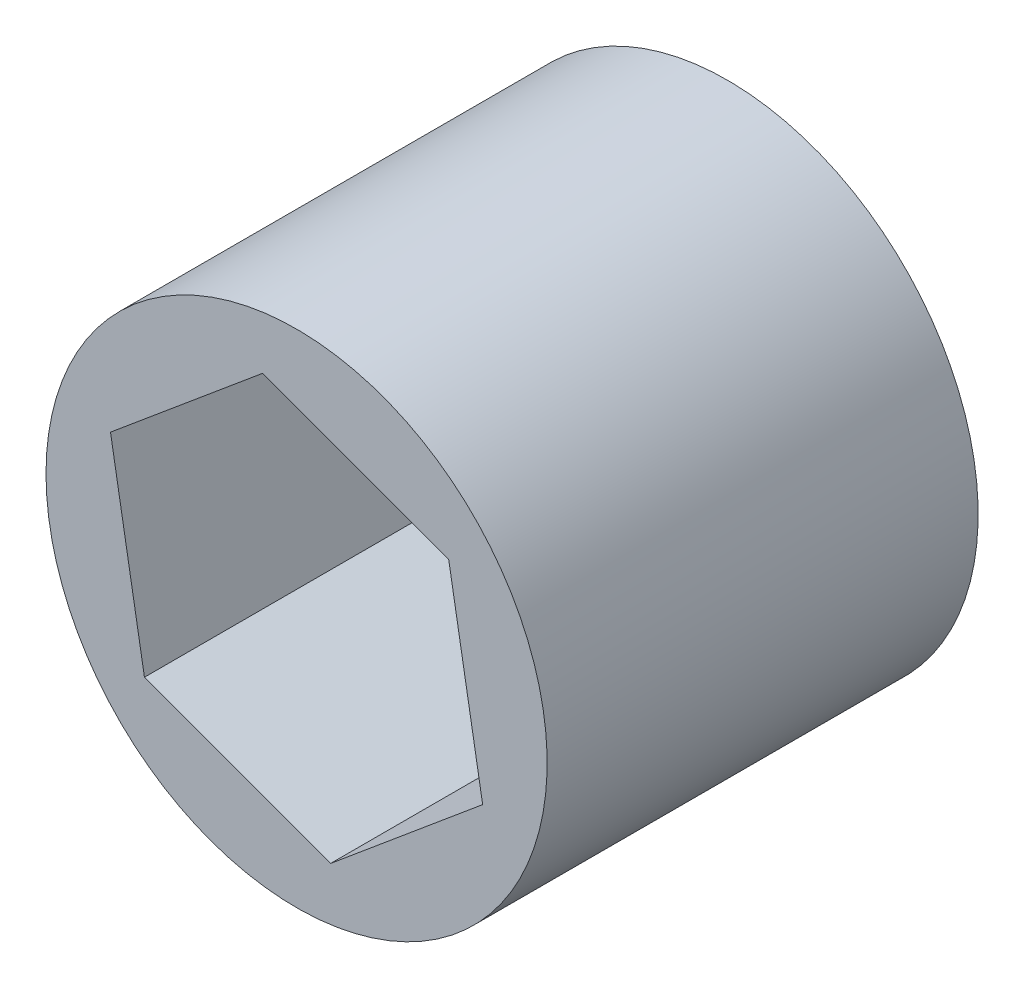
ISO-10303-21;
HEADER;
FILE_DESCRIPTION(('STEP AP214'),'2;1');
FILE_NAME('part.step','',(''),(''),'','','');
FILE_SCHEMA(('AUTOMOTIVE_DESIGN { 1 0 10303 214 1 1 1 1 }'));
ENDSEC;
DATA;
#1=APPLICATION_CONTEXT('core data for automotive mechanical design processes');
#2=APPLICATION_PROTOCOL_DEFINITION('international standard','automotive_design',2000,#1);
#3=PRODUCT_CONTEXT('',#1,'mechanical');
#4=PRODUCT('Part','Part','',(#3));
#5=PRODUCT_RELATED_PRODUCT_CATEGORY('part','',(#4));
#6=PRODUCT_DEFINITION_FORMATION('','',#4);
#7=PRODUCT_DEFINITION_CONTEXT('part definition',#1,'design');
#8=PRODUCT_DEFINITION('design','',#6,#7);
#9=PRODUCT_DEFINITION_SHAPE('','',#8);
#10=(LENGTH_UNIT() NAMED_UNIT(*) SI_UNIT(.MILLI.,.METRE.));
#11=(NAMED_UNIT(*) PLANE_ANGLE_UNIT() SI_UNIT($,.RADIAN.));
#12=(NAMED_UNIT(*) SI_UNIT($,.STERADIAN.) SOLID_ANGLE_UNIT());
#13=UNCERTAINTY_MEASURE_WITH_UNIT(LENGTH_MEASURE(1.E-05),#10,'distance_accuracy_value','');
#14=(GEOMETRIC_REPRESENTATION_CONTEXT(3) GLOBAL_UNCERTAINTY_ASSIGNED_CONTEXT((#13)) GLOBAL_UNIT_ASSIGNED_CONTEXT((#10,
#11,#12)) REPRESENTATION_CONTEXT('',''));
#15=CARTESIAN_POINT('',(0.,0.,0.));
#16=DIRECTION('',(0.,0.,1.));
#17=DIRECTION('',(1.,0.,0.));
#18=AXIS2_PLACEMENT_3D('',#15,#16,#17);
#19=CARTESIAN_POINT('',(0.,0.,17.2));
#20=DIRECTION('',(0.,0.,1.));
#21=DIRECTION('',(1.,0.,0.));
#22=AXIS2_PLACEMENT_3D('',#19,#20,#21);
#23=PLANE('',#22);
#24=CARTESIAN_POINT('',(0.,0.,17.2));
#25=DIRECTION('',(0.,0.,1.));
#26=DIRECTION('',(1.,0.,0.));
#27=AXIS2_PLACEMENT_3D('',#24,#25,#26);
#28=CIRCLE('',#27,10.);
#29=CARTESIAN_POINT('',(-10.,0.,17.2));
#30=VERTEX_POINT('',#29);
#31=EDGE_CURVE('E11',#30,#30,#28,.T.);
#32=ORIENTED_EDGE('',*,*,#31,.T.);
#33=EDGE_LOOP('',(#32));
#34=FACE_BOUND('',#33,.T.);
#35=DIRECTION('',(0.171304886401219,-0.985218065148556,0.));
#36=VECTOR('',#35,1.);
#37=CARTESIAN_POINT('',(-7.42622876386672,2.72295054675106,17.2));
#38=LINE('',#37,#36);
#39=CARTESIAN_POINT('',(-7.42622876386672,2.72295054675106,17.2));
#40=VERTEX_POINT('',#39);
#41=CARTESIAN_POINT('',(-6.0712587286685,-5.06982749044776,17.2));
#42=VERTEX_POINT('',#41);
#43=EDGE_CURVE('E94',#40,#42,#38,.T.);
#44=ORIENTED_EDGE('',*,*,#43,.F.);
#45=DIRECTION('',(-0.767571429485392,-0.640963415990141,0.));
#46=VECTOR('',#45,1.);
#47=CARTESIAN_POINT('',(-1.35497003519821,7.79277803719882,17.2));
#48=LINE('',#47,#46);
#49=CARTESIAN_POINT('',(-1.35497003519821,7.79277803719882,17.2));
#50=VERTEX_POINT('',#49);
#51=EDGE_CURVE('E86',#50,#40,#48,.T.);
#52=ORIENTED_EDGE('',*,*,#51,.F.);
#53=DIRECTION('',(-0.938876315886612,0.344254649158415,0.));
#54=VECTOR('',#53,1.);
#55=CARTESIAN_POINT('',(6.0712587286685,5.06982749044776,17.2));
#56=LINE('',#55,#54);
#57=CARTESIAN_POINT('',(6.0712587286685,5.06982749044776,17.2));
#58=VERTEX_POINT('',#57);
#59=EDGE_CURVE('E114',#58,#50,#56,.T.);
#60=ORIENTED_EDGE('',*,*,#59,.F.);
#61=DIRECTION('',(-0.171304886401219,0.985218065148557,0.));
#62=VECTOR('',#61,1.);
#63=CARTESIAN_POINT('',(7.42622876386672,-2.72295054675106,17.2));
#64=LINE('',#63,#62);
#65=CARTESIAN_POINT('',(7.42622876386672,-2.72295054675106,17.2));
#66=VERTEX_POINT('',#65);
#67=EDGE_CURVE('E112',#66,#58,#64,.T.);
#68=ORIENTED_EDGE('',*,*,#67,.F.);
#69=DIRECTION('',(0.767571429485392,0.640963415990142,0.));
#70=VECTOR('',#69,1.);
#71=CARTESIAN_POINT('',(1.35497003519822,-7.79277803719882,17.2));
#72=LINE('',#71,#70);
#73=CARTESIAN_POINT('',(1.35497003519822,-7.79277803719882,17.2));
#74=VERTEX_POINT('',#73);
#75=EDGE_CURVE('E108',#74,#66,#72,.T.);
#76=ORIENTED_EDGE('',*,*,#75,.F.);
#77=DIRECTION('',(0.938876315886612,-0.344254649158415,0.));
#78=VECTOR('',#77,1.);
#79=CARTESIAN_POINT('',(-6.0712587286685,-5.06982749044776,17.2));
#80=LINE('',#79,#78);
#81=EDGE_CURVE('E106',#42,#74,#80,.T.);
#82=ORIENTED_EDGE('',*,*,#81,.F.);
#83=EDGE_LOOP('',(#44,#52,#60,#68,#76,#82));
#84=FACE_BOUND('',#83,.T.);
#85=ADVANCED_FACE('F33',(#34,#84),#23,.T.);
#86=CARTESIAN_POINT('',(0.,0.,0.));
#87=DIRECTION('',(0.,0.,1.));
#88=DIRECTION('',(1.,0.,0.));
#89=AXIS2_PLACEMENT_3D('',#86,#87,#88);
#90=PLANE('',#89);
#91=CARTESIAN_POINT('',(0.,0.,0.));
#92=DIRECTION('',(0.,0.,1.));
#93=DIRECTION('',(1.,0.,0.));
#94=AXIS2_PLACEMENT_3D('',#91,#92,#93);
#95=CIRCLE('',#94,10.);
#96=CARTESIAN_POINT('',(-10.,0.,0.));
#97=VERTEX_POINT('',#96);
#98=EDGE_CURVE('E37',#97,#97,#95,.T.);
#99=ORIENTED_EDGE('',*,*,#98,.F.);
#100=EDGE_LOOP('',(#99));
#101=FACE_BOUND('',#100,.T.);
#102=DIRECTION('',(-0.767571429485392,-0.640963415990141,0.));
#103=VECTOR('',#102,1.);
#104=CARTESIAN_POINT('',(-1.35497003519821,7.79277803719882,0.));
#105=LINE('',#104,#103);
#106=CARTESIAN_POINT('',(-1.35497003519821,7.79277803719882,0.));
#107=VERTEX_POINT('',#106);
#108=CARTESIAN_POINT('',(-7.42622876386672,2.72295054675106,0.));
#109=VERTEX_POINT('',#108);
#110=EDGE_CURVE('E56',#107,#109,#105,.T.);
#111=ORIENTED_EDGE('',*,*,#110,.T.);
#112=DIRECTION('',(0.171304886401219,-0.985218065148556,0.));
#113=VECTOR('',#112,1.);
#114=CARTESIAN_POINT('',(-7.42622876386672,2.72295054675106,0.));
#115=LINE('',#114,#113);
#116=CARTESIAN_POINT('',(-6.0712587286685,-5.06982749044776,0.));
#117=VERTEX_POINT('',#116);
#118=EDGE_CURVE('E101',#109,#117,#115,.T.);
#119=ORIENTED_EDGE('',*,*,#118,.T.);
#120=DIRECTION('',(0.938876315886612,-0.344254649158415,0.));
#121=VECTOR('',#120,1.);
#122=CARTESIAN_POINT('',(-6.0712587286685,-5.06982749044776,0.));
#123=LINE('',#122,#121);
#124=CARTESIAN_POINT('',(1.35497003519822,-7.79277803719882,0.));
#125=VERTEX_POINT('',#124);
#126=EDGE_CURVE('E118',#117,#125,#123,.T.);
#127=ORIENTED_EDGE('',*,*,#126,.T.);
#128=DIRECTION('',(0.767571429485392,0.640963415990142,0.));
#129=VECTOR('',#128,1.);
#130=CARTESIAN_POINT('',(1.35497003519822,-7.79277803719882,0.));
#131=LINE('',#130,#129);
#132=CARTESIAN_POINT('',(7.42622876386672,-2.72295054675106,0.));
#133=VERTEX_POINT('',#132);
#134=EDGE_CURVE('E121',#125,#133,#131,.T.);
#135=ORIENTED_EDGE('',*,*,#134,.T.);
#136=DIRECTION('',(-0.171304886401219,0.985218065148557,0.));
#137=VECTOR('',#136,1.);
#138=CARTESIAN_POINT('',(7.42622876386672,-2.72295054675106,0.));
#139=LINE('',#138,#137);
#140=CARTESIAN_POINT('',(6.0712587286685,5.06982749044776,0.));
#141=VERTEX_POINT('',#140);
#142=EDGE_CURVE('E124',#133,#141,#139,.T.);
#143=ORIENTED_EDGE('',*,*,#142,.T.);
#144=DIRECTION('',(-0.938876315886612,0.344254649158415,0.));
#145=VECTOR('',#144,1.);
#146=CARTESIAN_POINT('',(6.0712587286685,5.06982749044776,0.));
#147=LINE('',#146,#145);
#148=EDGE_CURVE('E95',#141,#107,#147,.T.);
#149=ORIENTED_EDGE('',*,*,#148,.T.);
#150=EDGE_LOOP('',(#111,#119,#127,#135,#143,#149));
#151=FACE_BOUND('',#150,.T.);
#152=ADVANCED_FACE('F141',(#101,#151),#90,.F.);
#153=CARTESIAN_POINT('',(0.,0.,17.2));
#154=DIRECTION('',(0.,0.,-1.));
#155=DIRECTION('',(-1.,0.,0.));
#156=AXIS2_PLACEMENT_3D('',#153,#154,#155);
#157=CYLINDRICAL_SURFACE('',#156,10.);
#158=CARTESIAN_POINT('',(-10.,0.,17.2));
#159=CARTESIAN_POINT('',(-10.,0.,17.0208333333333));
#160=CARTESIAN_POINT('',(-10.,0.,16.8416666666667));
#161=CARTESIAN_POINT('',(-10.,0.,16.4833333333333));
#162=CARTESIAN_POINT('',(-10.,0.,16.3041666666667));
#163=CARTESIAN_POINT('',(-10.,0.,15.9458333333333));
#164=CARTESIAN_POINT('',(-10.,0.,15.7666666666667));
#165=CARTESIAN_POINT('',(-10.,0.,15.4083333333333));
#166=CARTESIAN_POINT('',(-10.,0.,15.2291666666667));
#167=CARTESIAN_POINT('',(-10.,0.,14.8708333333333));
#168=CARTESIAN_POINT('',(-10.,0.,14.6916666666667));
#169=CARTESIAN_POINT('',(-10.,0.,14.3333333333333));
#170=CARTESIAN_POINT('',(-10.,0.,14.1541666666667));
#171=CARTESIAN_POINT('',(-10.,0.,13.7958333333333));
#172=CARTESIAN_POINT('',(-10.,0.,13.6166666666667));
#173=CARTESIAN_POINT('',(-10.,0.,13.2583333333333));
#174=CARTESIAN_POINT('',(-10.,0.,13.0791666666667));
#175=CARTESIAN_POINT('',(-10.,0.,12.7208333333333));
#176=CARTESIAN_POINT('',(-10.,0.,12.5416666666667));
#177=CARTESIAN_POINT('',(-10.,0.,12.1833333333333));
#178=CARTESIAN_POINT('',(-10.,0.,12.0041666666667));
#179=CARTESIAN_POINT('',(-10.,0.,11.6458333333333));
#180=CARTESIAN_POINT('',(-10.,0.,11.4666666666667));
#181=CARTESIAN_POINT('',(-10.,0.,11.1083333333333));
#182=CARTESIAN_POINT('',(-10.,0.,10.9291666666667));
#183=CARTESIAN_POINT('',(-10.,0.,10.5708333333333));
#184=CARTESIAN_POINT('',(-10.,0.,10.3916666666667));
#185=CARTESIAN_POINT('',(-10.,0.,10.0333333333333));
#186=CARTESIAN_POINT('',(-10.,0.,9.85416666666666));
#187=CARTESIAN_POINT('',(-10.,0.,9.49583333333333));
#188=CARTESIAN_POINT('',(-10.,0.,9.31666666666666));
#189=CARTESIAN_POINT('',(-10.,0.,8.95833333333333));
#190=CARTESIAN_POINT('',(-10.,0.,8.77916666666667));
#191=CARTESIAN_POINT('',(-10.,0.,8.42083333333333));
#192=CARTESIAN_POINT('',(-10.,0.,8.24166666666667));
#193=CARTESIAN_POINT('',(-10.,0.,7.88333333333333));
#194=CARTESIAN_POINT('',(-10.,0.,7.70416666666667));
#195=CARTESIAN_POINT('',(-10.,0.,7.34583333333333));
#196=CARTESIAN_POINT('',(-10.,0.,7.16666666666666));
#197=CARTESIAN_POINT('',(-10.,0.,6.80833333333333));
#198=CARTESIAN_POINT('',(-10.,0.,6.62916666666666));
#199=CARTESIAN_POINT('',(-10.,0.,6.27083333333333));
#200=CARTESIAN_POINT('',(-10.,0.,6.09166666666666));
#201=CARTESIAN_POINT('',(-10.,0.,5.73333333333333));
#202=CARTESIAN_POINT('',(-10.,0.,5.55416666666666));
#203=CARTESIAN_POINT('',(-10.,0.,5.19583333333333));
#204=CARTESIAN_POINT('',(-10.,0.,5.01666666666666));
#205=CARTESIAN_POINT('',(-10.,0.,4.65833333333333));
#206=CARTESIAN_POINT('',(-10.,0.,4.47916666666667));
#207=CARTESIAN_POINT('',(-10.,0.,4.12083333333333));
#208=CARTESIAN_POINT('',(-10.,0.,3.94166666666666));
#209=CARTESIAN_POINT('',(-10.,0.,3.58333333333333));
#210=CARTESIAN_POINT('',(-10.,0.,3.40416666666666));
#211=CARTESIAN_POINT('',(-10.,0.,3.04583333333333));
#212=CARTESIAN_POINT('',(-10.,0.,2.86666666666666));
#213=CARTESIAN_POINT('',(-10.,0.,2.50833333333333));
#214=CARTESIAN_POINT('',(-10.,0.,2.32916666666666));
#215=CARTESIAN_POINT('',(-10.,0.,1.97083333333333));
#216=CARTESIAN_POINT('',(-10.,0.,1.79166666666666));
#217=CARTESIAN_POINT('',(-10.,0.,1.43333333333333));
#218=CARTESIAN_POINT('',(-10.,0.,1.25416666666666));
#219=CARTESIAN_POINT('',(-10.,0.,0.895833333333329));
#220=CARTESIAN_POINT('',(-10.,0.,0.716666666666663));
#221=CARTESIAN_POINT('',(-10.,0.,0.35833333333333));
#222=CARTESIAN_POINT('',(-10.,0.,0.179166666666663));
#223=CARTESIAN_POINT('',(-10.,0.,0.));
#224=B_SPLINE_CURVE_WITH_KNOTS('',3,(#158,#159,#160,#161,#162,#163,#164,#165,#166,#167,#168,
#169,#170,#171,#172,#173,#174,#175,#176,#177,#178,#179,#180,#181,#182,#183,#184,#185,#186,#187,
#188,#189,#190,#191,#192,#193,#194,#195,#196,#197,#198,#199,#200,#201,#202,#203,#204,#205,#206,
#207,#208,#209,#210,#211,#212,#213,#214,#215,#216,#217,#218,#219,#220,#221,#222,#223),
.UNSPECIFIED.,.F.,.F.,(4,2,2,2,2,2,2,2,2,2,2,2,2,2,2,2,2,2,2,2,2,2,2,2,2,2,2,2,2,2,2,2,4),(0.,
0.5375,1.075,1.6125,2.15,2.6875,3.225,3.7625,4.3,4.8375,5.375,5.9125,6.45,6.9875,7.525,8.0625,
8.6,9.1375,9.675,10.2125,10.75,11.2875,11.825,12.3625,12.9,13.4375,13.975,14.5125,15.05,15.5875,
16.125,16.6625,17.2),.UNSPECIFIED.);
#225=EDGE_CURVE('BSEAM35',#30,#97,#224,.T.);
#226=ORIENTED_EDGE('',*,*,#31,.F.);
#227=ORIENTED_EDGE('',*,*,#98,.T.);
#228=ORIENTED_EDGE('',*,*,#225,.T.);
#229=ORIENTED_EDGE('',*,*,#225,.F.);
#230=EDGE_LOOP('',(#226,#228,#227,#229));
#231=FACE_BOUND('',#230,.T.);
#232=ADVANCED_FACE('F35',(#231),#157,.T.);
#233=CARTESIAN_POINT('',(-1.35497003519821,7.79277803719882,17.2));
#234=DIRECTION('',(0.640963415990142,-0.767571429485392,0.));
#235=DIRECTION('',(0.767571429485392,0.640963415990142,0.));
#236=AXIS2_PLACEMENT_3D('',#233,#234,#235);
#237=PLANE('',#236);
#238=ORIENTED_EDGE('',*,*,#110,.F.);
#239=DIRECTION('',(0.,0.,-1.));
#240=VECTOR('',#239,1.);
#241=CARTESIAN_POINT('',(-1.35497003519821,7.79277803719882,17.2));
#242=LINE('',#241,#240);
#243=EDGE_CURVE('E90',#50,#107,#242,.T.);
#244=ORIENTED_EDGE('',*,*,#243,.F.);
#245=ORIENTED_EDGE('',*,*,#51,.T.);
#246=DIRECTION('',(0.,0.,-1.));
#247=VECTOR('',#246,1.);
#248=CARTESIAN_POINT('',(-7.42622876386672,2.72295054675106,17.2));
#249=LINE('',#248,#247);
#250=EDGE_CURVE('E89',#40,#109,#249,.T.);
#251=ORIENTED_EDGE('',*,*,#250,.T.);
#252=EDGE_LOOP('',(#238,#244,#245,#251));
#253=FACE_BOUND('',#252,.T.);
#254=ADVANCED_FACE('F88',(#253),#237,.T.);
#255=CARTESIAN_POINT('',(-7.42622876386672,2.72295054675106,17.2));
#256=DIRECTION('',(0.985218065148557,0.171304886401219,0.));
#257=DIRECTION('',(-0.171304886401219,0.985218065148557,0.));
#258=AXIS2_PLACEMENT_3D('',#255,#256,#257);
#259=PLANE('',#258);
#260=ORIENTED_EDGE('',*,*,#118,.F.);
#261=ORIENTED_EDGE('',*,*,#250,.F.);
#262=ORIENTED_EDGE('',*,*,#43,.T.);
#263=DIRECTION('',(0.,0.,-1.));
#264=VECTOR('',#263,1.);
#265=CARTESIAN_POINT('',(-6.0712587286685,-5.06982749044776,17.2));
#266=LINE('',#265,#264);
#267=EDGE_CURVE('E102',#42,#117,#266,.T.);
#268=ORIENTED_EDGE('',*,*,#267,.T.);
#269=EDGE_LOOP('',(#260,#261,#262,#268));
#270=FACE_BOUND('',#269,.T.);
#271=ADVANCED_FACE('F98',(#270),#259,.T.);
#272=CARTESIAN_POINT('',(-6.0712587286685,-5.06982749044776,17.2));
#273=DIRECTION('',(0.344254649158415,0.938876315886612,0.));
#274=DIRECTION('',(-0.938876315886612,0.344254649158415,0.));
#275=AXIS2_PLACEMENT_3D('',#272,#273,#274);
#276=PLANE('',#275);
#277=ORIENTED_EDGE('',*,*,#126,.F.);
#278=ORIENTED_EDGE('',*,*,#267,.F.);
#279=ORIENTED_EDGE('',*,*,#81,.T.);
#280=DIRECTION('',(0.,0.,-1.));
#281=VECTOR('',#280,1.);
#282=CARTESIAN_POINT('',(1.35497003519822,-7.79277803719882,17.2));
#283=LINE('',#282,#281);
#284=EDGE_CURVE('E133',#74,#125,#283,.T.);
#285=ORIENTED_EDGE('',*,*,#284,.T.);
#286=EDGE_LOOP('',(#277,#278,#279,#285));
#287=FACE_BOUND('',#286,.T.);
#288=ADVANCED_FACE('F137',(#287),#276,.T.);
#289=CARTESIAN_POINT('',(1.35497003519822,-7.79277803719882,17.2));
#290=DIRECTION('',(-0.640963415990142,0.767571429485392,0.));
#291=DIRECTION('',(-0.767571429485392,-0.640963415990142,0.));
#292=AXIS2_PLACEMENT_3D('',#289,#290,#291);
#293=PLANE('',#292);
#294=ORIENTED_EDGE('',*,*,#134,.F.);
#295=ORIENTED_EDGE('',*,*,#284,.F.);
#296=ORIENTED_EDGE('',*,*,#75,.T.);
#297=DIRECTION('',(0.,0.,-1.));
#298=VECTOR('',#297,1.);
#299=CARTESIAN_POINT('',(7.42622876386672,-2.72295054675106,17.2));
#300=LINE('',#299,#298);
#301=EDGE_CURVE('E131',#66,#133,#300,.T.);
#302=ORIENTED_EDGE('',*,*,#301,.T.);
#303=EDGE_LOOP('',(#294,#295,#296,#302));
#304=FACE_BOUND('',#303,.T.);
#305=ADVANCED_FACE('F149',(#304),#293,.T.);
#306=CARTESIAN_POINT('',(7.42622876386672,-2.72295054675106,17.2));
#307=DIRECTION('',(-0.985218065148557,-0.171304886401219,0.));
#308=DIRECTION('',(0.171304886401219,-0.985218065148557,0.));
#309=AXIS2_PLACEMENT_3D('',#306,#307,#308);
#310=PLANE('',#309);
#311=ORIENTED_EDGE('',*,*,#142,.F.);
#312=ORIENTED_EDGE('',*,*,#301,.F.);
#313=ORIENTED_EDGE('',*,*,#67,.T.);
#314=DIRECTION('',(0.,0.,-1.));
#315=VECTOR('',#314,1.);
#316=CARTESIAN_POINT('',(6.0712587286685,5.06982749044776,17.2));
#317=LINE('',#316,#315);
#318=EDGE_CURVE('E48',#58,#141,#317,.T.);
#319=ORIENTED_EDGE('',*,*,#318,.T.);
#320=EDGE_LOOP('',(#311,#312,#313,#319));
#321=FACE_BOUND('',#320,.T.);
#322=ADVANCED_FACE('F147',(#321),#310,.T.);
#323=CARTESIAN_POINT('',(6.0712587286685,5.06982749044776,17.2));
#324=DIRECTION('',(-0.344254649158415,-0.938876315886612,0.));
#325=DIRECTION('',(0.938876315886612,-0.344254649158415,0.));
#326=AXIS2_PLACEMENT_3D('',#323,#324,#325);
#327=PLANE('',#326);
#328=ORIENTED_EDGE('',*,*,#148,.F.);
#329=ORIENTED_EDGE('',*,*,#318,.F.);
#330=ORIENTED_EDGE('',*,*,#59,.T.);
#331=ORIENTED_EDGE('',*,*,#243,.T.);
#332=EDGE_LOOP('',(#328,#329,#330,#331));
#333=FACE_BOUND('',#332,.T.);
#334=ADVANCED_FACE('F143',(#333),#327,.T.);
#335=CLOSED_SHELL('',(#85,#152,#232,#254,#271,#288,#305,#322,#334));
#336=MANIFOLD_SOLID_BREP('B2',#335);
#337=ADVANCED_BREP_SHAPE_REPRESENTATION('',(#18,#336),#14);
#338=SHAPE_DEFINITION_REPRESENTATION(#9,#337);
ENDSEC;
END-ISO-10303-21;
